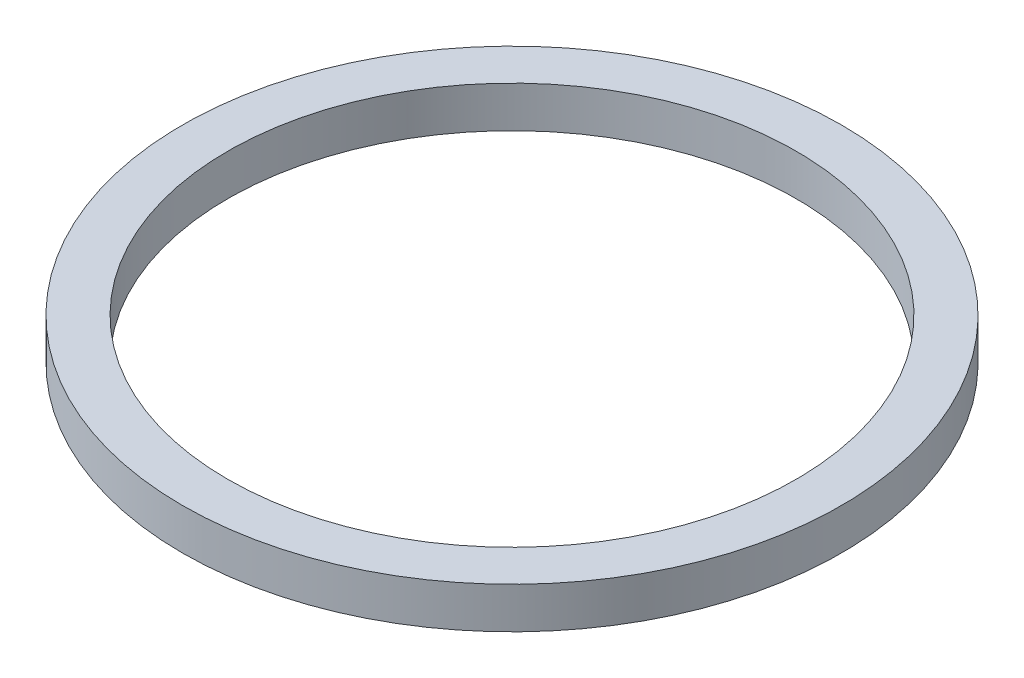
ISO-10303-21;
HEADER;
FILE_DESCRIPTION(('STEP AP214'),'2;1');
FILE_NAME('part.step','',(''),(''),'','','');
FILE_SCHEMA(('AUTOMOTIVE_DESIGN { 1 0 10303 214 1 1 1 1 }'));
ENDSEC;
DATA;
#1=APPLICATION_CONTEXT('core data for automotive mechanical design processes');
#2=APPLICATION_PROTOCOL_DEFINITION('international standard','automotive_design',2000,#1);
#3=PRODUCT_CONTEXT('',#1,'mechanical');
#4=PRODUCT('Part','Part','',(#3));
#5=PRODUCT_RELATED_PRODUCT_CATEGORY('part','',(#4));
#6=PRODUCT_DEFINITION_FORMATION('','',#4);
#7=PRODUCT_DEFINITION_CONTEXT('part definition',#1,'design');
#8=PRODUCT_DEFINITION('design','',#6,#7);
#9=PRODUCT_DEFINITION_SHAPE('','',#8);
#10=(LENGTH_UNIT() NAMED_UNIT(*) SI_UNIT(.MILLI.,.METRE.));
#11=(NAMED_UNIT(*) PLANE_ANGLE_UNIT() SI_UNIT($,.RADIAN.));
#12=(NAMED_UNIT(*) SI_UNIT($,.STERADIAN.) SOLID_ANGLE_UNIT());
#13=UNCERTAINTY_MEASURE_WITH_UNIT(LENGTH_MEASURE(1.E-05),#10,'distance_accuracy_value','');
#14=(GEOMETRIC_REPRESENTATION_CONTEXT(3) GLOBAL_UNCERTAINTY_ASSIGNED_CONTEXT((#13)) GLOBAL_UNIT_ASSIGNED_CONTEXT((#10,
#11,#12)) REPRESENTATION_CONTEXT('',''));
#15=CARTESIAN_POINT('',(0.,0.,0.));
#16=DIRECTION('',(0.,0.,1.));
#17=DIRECTION('',(1.,0.,0.));
#18=AXIS2_PLACEMENT_3D('',#15,#16,#17);
#19=CARTESIAN_POINT('',(0.,10.,0.));
#20=DIRECTION('',(0.,1.,0.));
#21=DIRECTION('',(0.,0.,1.));
#22=AXIS2_PLACEMENT_3D('',#19,#20,#21);
#23=PLANE('',#22);
#24=CARTESIAN_POINT('',(0.,10.,0.));
#25=DIRECTION('',(0.,1.,0.));
#26=DIRECTION('',(0.,0.,1.));
#27=AXIS2_PLACEMENT_3D('',#24,#25,#26);
#28=CIRCLE('',#27,80.);
#29=CARTESIAN_POINT('',(0.,10.,80.));
#30=VERTEX_POINT('',#29);
#31=EDGE_CURVE('E10',#30,#30,#28,.T.);
#32=ORIENTED_EDGE('',*,*,#31,.T.);
#33=EDGE_LOOP('',(#32));
#34=FACE_BOUND('',#33,.T.);
#35=CARTESIAN_POINT('',(0.,10.,0.));
#36=DIRECTION('',(0.,1.,0.));
#37=DIRECTION('',(0.,0.,1.));
#38=AXIS2_PLACEMENT_3D('',#35,#36,#37);
#39=CIRCLE('',#38,69.);
#40=CARTESIAN_POINT('',(0.,10.,69.));
#41=VERTEX_POINT('',#40);
#42=EDGE_CURVE('E42',#41,#41,#39,.T.);
#43=ORIENTED_EDGE('',*,*,#42,.F.);
#44=EDGE_LOOP('',(#43));
#45=FACE_BOUND('',#44,.T.);
#46=ADVANCED_FACE('F31',(#34,#45),#23,.T.);
#47=CARTESIAN_POINT('',(0.,0.,0.));
#48=DIRECTION('',(0.,1.,0.));
#49=DIRECTION('',(0.,0.,1.));
#50=AXIS2_PLACEMENT_3D('',#47,#48,#49);
#51=PLANE('',#50);
#52=CARTESIAN_POINT('',(0.,0.,0.));
#53=DIRECTION('',(0.,1.,0.));
#54=DIRECTION('',(0.,0.,1.));
#55=AXIS2_PLACEMENT_3D('',#52,#53,#54);
#56=CIRCLE('',#55,80.);
#57=CARTESIAN_POINT('',(0.,0.,80.));
#58=VERTEX_POINT('',#57);
#59=EDGE_CURVE('E35',#58,#58,#56,.T.);
#60=ORIENTED_EDGE('',*,*,#59,.F.);
#61=EDGE_LOOP('',(#60));
#62=FACE_BOUND('',#61,.T.);
#63=CARTESIAN_POINT('',(0.,0.,0.));
#64=DIRECTION('',(0.,1.,0.));
#65=DIRECTION('',(0.,0.,1.));
#66=AXIS2_PLACEMENT_3D('',#63,#64,#65);
#67=CIRCLE('',#66,69.);
#68=CARTESIAN_POINT('',(0.,0.,69.));
#69=VERTEX_POINT('',#68);
#70=EDGE_CURVE('E44',#69,#69,#67,.T.);
#71=ORIENTED_EDGE('',*,*,#70,.T.);
#72=EDGE_LOOP('',(#71));
#73=FACE_BOUND('',#72,.T.);
#74=ADVANCED_FACE('F54',(#62,#73),#51,.F.);
#75=CARTESIAN_POINT('',(0.,10.,0.));
#76=DIRECTION('',(0.,-1.,0.));
#77=DIRECTION('',(0.,0.,-1.));
#78=AXIS2_PLACEMENT_3D('',#75,#76,#77);
#79=CYLINDRICAL_SURFACE('',#78,80.);
#80=ORIENTED_EDGE('',*,*,#31,.F.);
#81=EDGE_LOOP('',(#80));
#82=FACE_BOUND('',#81,.T.);
#83=ORIENTED_EDGE('',*,*,#59,.T.);
#84=EDGE_LOOP('',(#83));
#85=FACE_BOUND('',#84,.T.);
#86=ADVANCED_FACE('F33',(#82,#85),#79,.T.);
#87=CARTESIAN_POINT('',(0.,10.,0.));
#88=DIRECTION('',(0.,-1.,0.));
#89=DIRECTION('',(0.,0.,-1.));
#90=AXIS2_PLACEMENT_3D('',#87,#88,#89);
#91=CYLINDRICAL_SURFACE('',#90,69.);
#92=ORIENTED_EDGE('',*,*,#42,.T.);
#93=EDGE_LOOP('',(#92));
#94=FACE_BOUND('',#93,.T.);
#95=ORIENTED_EDGE('',*,*,#70,.F.);
#96=EDGE_LOOP('',(#95));
#97=FACE_BOUND('',#96,.T.);
#98=ADVANCED_FACE('F50',(#94,#97),#91,.F.);
#99=CLOSED_SHELL('',(#46,#74,#86,#98));
#100=MANIFOLD_SOLID_BREP('B2',#99);
#101=ADVANCED_BREP_SHAPE_REPRESENTATION('',(#18,#100),#14);
#102=SHAPE_DEFINITION_REPRESENTATION(#9,#101);
ENDSEC;
END-ISO-10303-21;
